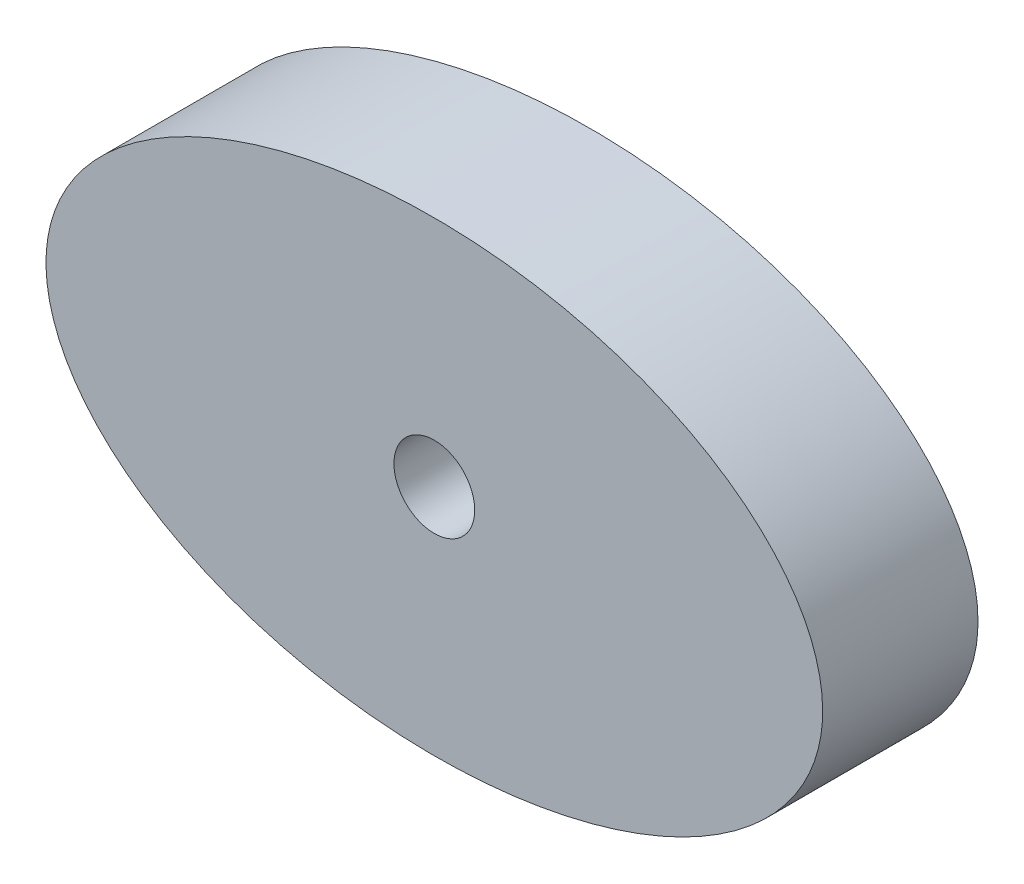
ISO-10303-21;
HEADER;
FILE_DESCRIPTION(('STEP AP214'),'2;1');
FILE_NAME('part.step','',(''),(''),'','','');
FILE_SCHEMA(('AUTOMOTIVE_DESIGN { 1 0 10303 214 1 1 1 1 }'));
ENDSEC;
DATA;
#1=APPLICATION_CONTEXT('core data for automotive mechanical design processes');
#2=APPLICATION_PROTOCOL_DEFINITION('international standard','automotive_design',2000,#1);
#3=PRODUCT_CONTEXT('',#1,'mechanical');
#4=PRODUCT('Part','Part','',(#3));
#5=PRODUCT_RELATED_PRODUCT_CATEGORY('part','',(#4));
#6=PRODUCT_DEFINITION_FORMATION('','',#4);
#7=PRODUCT_DEFINITION_CONTEXT('part definition',#1,'design');
#8=PRODUCT_DEFINITION('design','',#6,#7);
#9=PRODUCT_DEFINITION_SHAPE('','',#8);
#10=(LENGTH_UNIT() NAMED_UNIT(*) SI_UNIT(.MILLI.,.METRE.));
#11=(NAMED_UNIT(*) PLANE_ANGLE_UNIT() SI_UNIT($,.RADIAN.));
#12=(NAMED_UNIT(*) SI_UNIT($,.STERADIAN.) SOLID_ANGLE_UNIT());
#13=UNCERTAINTY_MEASURE_WITH_UNIT(LENGTH_MEASURE(1.E-05),#10,'distance_accuracy_value','');
#14=(GEOMETRIC_REPRESENTATION_CONTEXT(3) GLOBAL_UNCERTAINTY_ASSIGNED_CONTEXT((#13)) GLOBAL_UNIT_ASSIGNED_CONTEXT((#10,
#11,#12)) REPRESENTATION_CONTEXT('',''));
#15=CARTESIAN_POINT('',(0.,0.,0.));
#16=DIRECTION('',(0.,0.,1.));
#17=DIRECTION('',(1.,0.,0.));
#18=AXIS2_PLACEMENT_3D('',#15,#16,#17);
#19=CARTESIAN_POINT('',(0.,0.,5.));
#20=DIRECTION('',(0.,0.,1.));
#21=DIRECTION('',(1.,0.,0.));
#22=AXIS2_PLACEMENT_3D('',#19,#20,#21);
#23=PLANE('',#22);
#24=CARTESIAN_POINT('',(0.,0.,5.));
#25=DIRECTION('',(0.,0.,1.));
#26=DIRECTION('',(1.,0.,0.));
#27=AXIS2_PLACEMENT_3D('',#24,#25,#26);
#28=ELLIPSE('',#27,25.,15.);
#29=CARTESIAN_POINT('',(25.,0.,5.));
#30=VERTEX_POINT('',#29);
#31=EDGE_CURVE('E10',#30,#30,#28,.T.);
#32=ORIENTED_EDGE('',*,*,#31,.T.);
#33=EDGE_LOOP('',(#32));
#34=FACE_BOUND('',#33,.T.);
#35=CARTESIAN_POINT('',(0.,0.,5.));
#36=DIRECTION('',(0.,0.,1.));
#37=DIRECTION('',(1.,0.,0.));
#38=AXIS2_PLACEMENT_3D('',#35,#36,#37);
#39=CIRCLE('',#38,2.6);
#40=CARTESIAN_POINT('',(2.6,0.,5.));
#41=VERTEX_POINT('',#40);
#42=EDGE_CURVE('E42',#41,#41,#39,.T.);
#43=ORIENTED_EDGE('',*,*,#42,.F.);
#44=EDGE_LOOP('',(#43));
#45=FACE_BOUND('',#44,.T.);
#46=ADVANCED_FACE('F31',(#34,#45),#23,.T.);
#47=CARTESIAN_POINT('',(0.,0.,-5.));
#48=DIRECTION('',(0.,0.,1.));
#49=DIRECTION('',(1.,0.,0.));
#50=AXIS2_PLACEMENT_3D('',#47,#48,#49);
#51=PLANE('',#50);
#52=CARTESIAN_POINT('',(0.,0.,-5.));
#53=DIRECTION('',(0.,0.,1.));
#54=DIRECTION('',(1.,0.,0.));
#55=AXIS2_PLACEMENT_3D('',#52,#53,#54);
#56=ELLIPSE('',#55,25.,15.);
#57=CARTESIAN_POINT('',(25.,0.,-5.));
#58=VERTEX_POINT('',#57);
#59=EDGE_CURVE('E36',#58,#58,#56,.T.);
#60=ORIENTED_EDGE('',*,*,#59,.F.);
#61=EDGE_LOOP('',(#60));
#62=FACE_BOUND('',#61,.T.);
#63=CARTESIAN_POINT('',(0.,0.,-5.));
#64=DIRECTION('',(0.,0.,1.));
#65=DIRECTION('',(1.,0.,0.));
#66=AXIS2_PLACEMENT_3D('',#63,#64,#65);
#67=CIRCLE('',#66,2.6);
#68=CARTESIAN_POINT('',(2.6,0.,-5.));
#69=VERTEX_POINT('',#68);
#70=EDGE_CURVE('E45',#69,#69,#67,.T.);
#71=ORIENTED_EDGE('',*,*,#70,.T.);
#72=EDGE_LOOP('',(#71));
#73=FACE_BOUND('',#72,.T.);
#74=ADVANCED_FACE('F55',(#62,#73),#51,.F.);
#75=DIRECTION('',(0.,0.,-1.));
#76=VECTOR('',#75,1.);
#77=SURFACE_OF_LINEAR_EXTRUSION('',#28,#76);
#78=ORIENTED_EDGE('',*,*,#31,.F.);
#79=EDGE_LOOP('',(#78));
#80=FACE_BOUND('',#79,.T.);
#81=ORIENTED_EDGE('',*,*,#59,.T.);
#82=EDGE_LOOP('',(#81));
#83=FACE_BOUND('',#82,.T.);
#84=ADVANCED_FACE('F33',(#80,#83),#77,.F.);
#85=CARTESIAN_POINT('',(0.,0.,5.));
#86=DIRECTION('',(0.,0.,-1.));
#87=DIRECTION('',(-1.,0.,0.));
#88=AXIS2_PLACEMENT_3D('',#85,#86,#87);
#89=CYLINDRICAL_SURFACE('',#88,2.6);
#90=ORIENTED_EDGE('',*,*,#42,.T.);
#91=EDGE_LOOP('',(#90));
#92=FACE_BOUND('',#91,.T.);
#93=ORIENTED_EDGE('',*,*,#70,.F.);
#94=EDGE_LOOP('',(#93));
#95=FACE_BOUND('',#94,.T.);
#96=ADVANCED_FACE('F51',(#92,#95),#89,.F.);
#97=CLOSED_SHELL('',(#46,#74,#84,#96));
#98=MANIFOLD_SOLID_BREP('B2',#97);
#99=ADVANCED_BREP_SHAPE_REPRESENTATION('',(#18,#98),#14);
#100=SHAPE_DEFINITION_REPRESENTATION(#9,#99);
ENDSEC;
END-ISO-10303-21;
